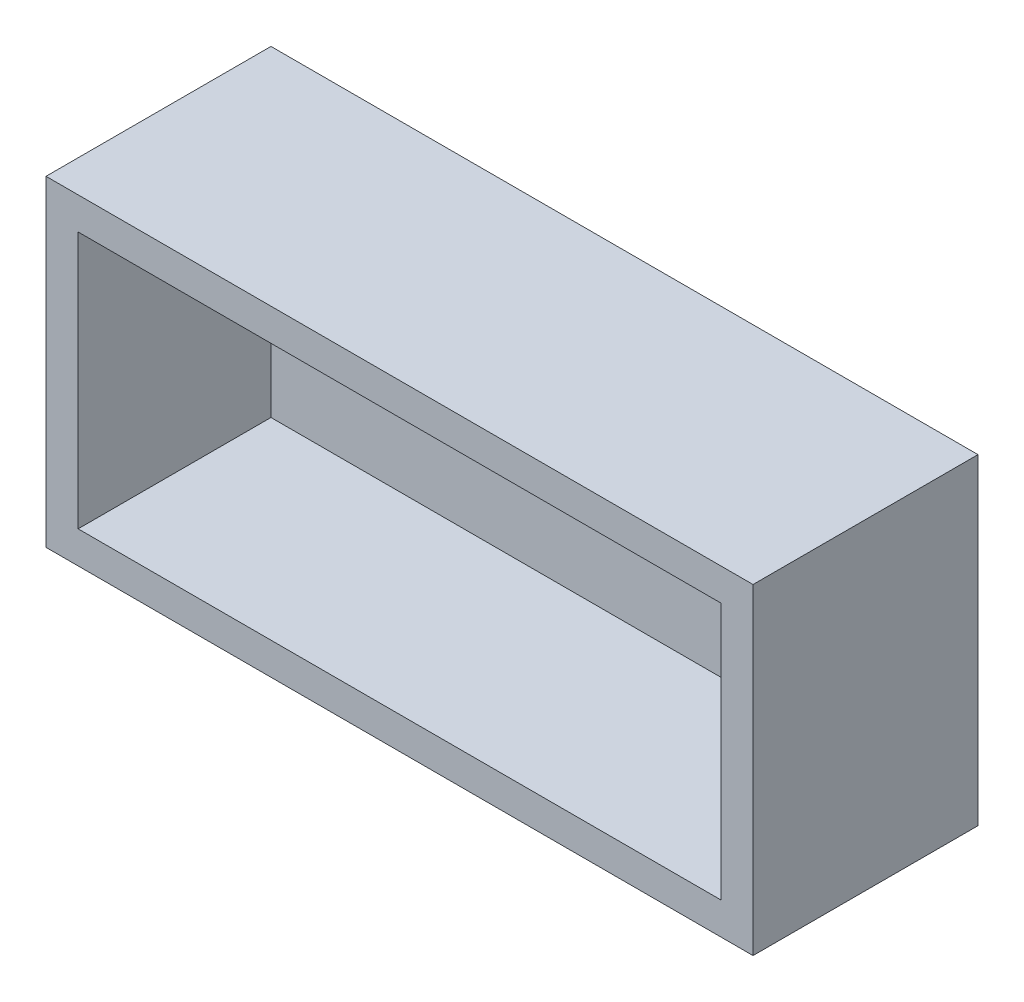
ISO-10303-21;
HEADER;
FILE_DESCRIPTION(('STEP AP214'),'2;1');
FILE_NAME('part.step','',(''),(''),'','','');
FILE_SCHEMA(('AUTOMOTIVE_DESIGN { 1 0 10303 214 1 1 1 1 }'));
ENDSEC;
DATA;
#1=APPLICATION_CONTEXT('core data for automotive mechanical design processes');
#2=APPLICATION_PROTOCOL_DEFINITION('international standard','automotive_design',2000,#1);
#3=PRODUCT_CONTEXT('',#1,'mechanical');
#4=PRODUCT('Part','Part','',(#3));
#5=PRODUCT_RELATED_PRODUCT_CATEGORY('part','',(#4));
#6=PRODUCT_DEFINITION_FORMATION('','',#4);
#7=PRODUCT_DEFINITION_CONTEXT('part definition',#1,'design');
#8=PRODUCT_DEFINITION('design','',#6,#7);
#9=PRODUCT_DEFINITION_SHAPE('','',#8);
#10=(LENGTH_UNIT() NAMED_UNIT(*) SI_UNIT(.MILLI.,.METRE.));
#11=(NAMED_UNIT(*) PLANE_ANGLE_UNIT() SI_UNIT($,.RADIAN.));
#12=(NAMED_UNIT(*) SI_UNIT($,.STERADIAN.) SOLID_ANGLE_UNIT());
#13=UNCERTAINTY_MEASURE_WITH_UNIT(LENGTH_MEASURE(1.E-05),#10,'distance_accuracy_value','');
#14=(GEOMETRIC_REPRESENTATION_CONTEXT(3) GLOBAL_UNCERTAINTY_ASSIGNED_CONTEXT((#13)) GLOBAL_UNIT_ASSIGNED_CONTEXT((#10,
#11,#12)) REPRESENTATION_CONTEXT('',''));
#15=CARTESIAN_POINT('',(0.,0.,0.));
#16=DIRECTION('',(0.,0.,1.));
#17=DIRECTION('',(1.,0.,0.));
#18=AXIS2_PLACEMENT_3D('',#15,#16,#17);
#19=CARTESIAN_POINT('',(0.,0.,9.));
#20=DIRECTION('',(0.,0.,1.));
#21=DIRECTION('',(1.,0.,0.));
#22=AXIS2_PLACEMENT_3D('',#19,#20,#21);
#23=PLANE('',#22);
#24=DIRECTION('',(0.,-1.,0.));
#25=VECTOR('',#24,1.);
#26=CARTESIAN_POINT('',(-53.5900984549038,28.935354346355,9.));
#27=LINE('',#26,#25);
#28=CARTESIAN_POINT('',(-53.5900984549038,28.935354346355,9.));
#29=VERTEX_POINT('',#28);
#30=CARTESIAN_POINT('',(-53.5900984549038,13.935354346355,9.));
#31=VERTEX_POINT('',#30);
#32=EDGE_CURVE('E154',#29,#31,#27,.T.);
#33=ORIENTED_EDGE('',*,*,#32,.T.);
#34=DIRECTION('',(1.,0.,0.));
#35=VECTOR('',#34,1.);
#36=CARTESIAN_POINT('',(-53.5900984549038,13.935354346355,9.));
#37=LINE('',#36,#35);
#38=CARTESIAN_POINT('',(-20.5900984549038,13.935354346355,9.));
#39=VERTEX_POINT('',#38);
#40=EDGE_CURVE('E101',#31,#39,#37,.T.);
#41=ORIENTED_EDGE('',*,*,#40,.T.);
#42=DIRECTION('',(0.,1.,0.));
#43=VECTOR('',#42,1.);
#44=CARTESIAN_POINT('',(-20.5900984549038,13.935354346355,9.));
#45=LINE('',#44,#43);
#46=CARTESIAN_POINT('',(-20.5900984549038,28.935354346355,9.));
#47=VERTEX_POINT('',#46);
#48=EDGE_CURVE('E157',#39,#47,#45,.T.);
#49=ORIENTED_EDGE('',*,*,#48,.T.);
#50=DIRECTION('',(-1.,0.,0.));
#51=VECTOR('',#50,1.);
#52=CARTESIAN_POINT('',(-53.5900984549038,28.935354346355,9.));
#53=LINE('',#52,#51);
#54=EDGE_CURVE('E55',#47,#29,#53,.T.);
#55=ORIENTED_EDGE('',*,*,#54,.T.);
#56=EDGE_LOOP('',(#33,#41,#49,#55));
#57=FACE_BOUND('',#56,.T.);
#58=DIRECTION('',(1.,0.,0.));
#59=VECTOR('',#58,1.);
#60=CARTESIAN_POINT('',(-52.0900984549038,15.435354346355,9.));
#61=LINE('',#60,#59);
#62=CARTESIAN_POINT('',(-52.0900984549038,15.435354346355,9.));
#63=VERTEX_POINT('',#62);
#64=CARTESIAN_POINT('',(-22.0900984549038,15.435354346355,9.));
#65=VERTEX_POINT('',#64);
#66=EDGE_CURVE('E129',#63,#65,#61,.T.);
#67=ORIENTED_EDGE('',*,*,#66,.F.);
#68=DIRECTION('',(0.,-1.,0.));
#69=VECTOR('',#68,1.);
#70=CARTESIAN_POINT('',(-52.0900984549038,27.435354346355,9.));
#71=LINE('',#70,#69);
#72=CARTESIAN_POINT('',(-52.0900984549038,27.435354346355,9.));
#73=VERTEX_POINT('',#72);
#74=EDGE_CURVE('E127',#73,#63,#71,.T.);
#75=ORIENTED_EDGE('',*,*,#74,.F.);
#76=DIRECTION('',(-1.,0.,0.));
#77=VECTOR('',#76,1.);
#78=CARTESIAN_POINT('',(-52.0900984549038,27.435354346355,9.));
#79=LINE('',#78,#77);
#80=CARTESIAN_POINT('',(-22.0900984549038,27.435354346355,9.));
#81=VERTEX_POINT('',#80);
#82=EDGE_CURVE('E134',#81,#73,#79,.T.);
#83=ORIENTED_EDGE('',*,*,#82,.F.);
#84=DIRECTION('',(0.,1.,0.));
#85=VECTOR('',#84,1.);
#86=CARTESIAN_POINT('',(-22.0900984549038,15.435354346355,9.));
#87=LINE('',#86,#85);
#88=EDGE_CURVE('E132',#65,#81,#87,.T.);
#89=ORIENTED_EDGE('',*,*,#88,.F.);
#90=EDGE_LOOP('',(#67,#75,#83,#89));
#91=FACE_BOUND('',#90,.T.);
#92=ADVANCED_FACE('F32',(#57,#91),#23,.T.);
#93=CARTESIAN_POINT('',(-53.5900984549038,28.935354346355,9.));
#94=DIRECTION('',(1.,0.,0.));
#95=DIRECTION('',(0.,0.,-1.));
#96=AXIS2_PLACEMENT_3D('',#93,#94,#95);
#97=PLANE('',#96);
#98=DIRECTION('',(0.,0.,-1.));
#99=VECTOR('',#98,1.);
#100=CARTESIAN_POINT('',(-53.5900984549038,28.935354346355,9.));
#101=LINE('',#100,#99);
#102=CARTESIAN_POINT('',(-53.5900984549038,28.935354346355,-1.5));
#103=VERTEX_POINT('',#102);
#104=EDGE_CURVE('E115',#29,#103,#101,.T.);
#105=ORIENTED_EDGE('',*,*,#104,.T.);
#106=DIRECTION('',(0.,-1.,0.));
#107=VECTOR('',#106,1.);
#108=CARTESIAN_POINT('',(-53.5900984549038,28.935354346355,-1.5));
#109=LINE('',#108,#107);
#110=CARTESIAN_POINT('',(-53.5900984549038,13.935354346355,-1.5));
#111=VERTEX_POINT('',#110);
#112=EDGE_CURVE('E110',#103,#111,#109,.T.);
#113=ORIENTED_EDGE('',*,*,#112,.T.);
#114=DIRECTION('',(0.,0.,-1.));
#115=VECTOR('',#114,1.);
#116=CARTESIAN_POINT('',(-53.5900984549038,13.935354346355,9.));
#117=LINE('',#116,#115);
#118=EDGE_CURVE('E11',#31,#111,#117,.T.);
#119=ORIENTED_EDGE('',*,*,#118,.F.);
#120=ORIENTED_EDGE('',*,*,#32,.F.);
#121=EDGE_LOOP('',(#105,#113,#119,#120));
#122=FACE_BOUND('',#121,.T.);
#123=ADVANCED_FACE('F34',(#122),#97,.F.);
#124=CARTESIAN_POINT('',(-53.5900984549038,13.935354346355,9.));
#125=DIRECTION('',(0.,1.,0.));
#126=DIRECTION('',(0.,0.,1.));
#127=AXIS2_PLACEMENT_3D('',#124,#125,#126);
#128=PLANE('',#127);
#129=ORIENTED_EDGE('',*,*,#118,.T.);
#130=DIRECTION('',(1.,0.,0.));
#131=VECTOR('',#130,1.);
#132=CARTESIAN_POINT('',(-53.5900984549038,13.935354346355,-1.5));
#133=LINE('',#132,#131);
#134=CARTESIAN_POINT('',(-20.5900984549038,13.935354346355,-1.5));
#135=VERTEX_POINT('',#134);
#136=EDGE_CURVE('E100',#111,#135,#133,.T.);
#137=ORIENTED_EDGE('',*,*,#136,.T.);
#138=DIRECTION('',(0.,0.,-1.));
#139=VECTOR('',#138,1.);
#140=CARTESIAN_POINT('',(-20.5900984549038,13.935354346355,9.));
#141=LINE('',#140,#139);
#142=EDGE_CURVE('E40',#39,#135,#141,.T.);
#143=ORIENTED_EDGE('',*,*,#142,.F.);
#144=ORIENTED_EDGE('',*,*,#40,.F.);
#145=EDGE_LOOP('',(#129,#137,#143,#144));
#146=FACE_BOUND('',#145,.T.);
#147=ADVANCED_FACE('F98',(#146),#128,.F.);
#148=CARTESIAN_POINT('',(-20.5900984549038,13.935354346355,9.));
#149=DIRECTION('',(-1.,0.,0.));
#150=DIRECTION('',(0.,0.,1.));
#151=AXIS2_PLACEMENT_3D('',#148,#149,#150);
#152=PLANE('',#151);
#153=ORIENTED_EDGE('',*,*,#142,.T.);
#154=DIRECTION('',(0.,1.,0.));
#155=VECTOR('',#154,1.);
#156=CARTESIAN_POINT('',(-20.5900984549038,13.935354346355,-1.5));
#157=LINE('',#156,#155);
#158=CARTESIAN_POINT('',(-20.5900984549038,28.935354346355,-1.5));
#159=VERTEX_POINT('',#158);
#160=EDGE_CURVE('E113',#135,#159,#157,.T.);
#161=ORIENTED_EDGE('',*,*,#160,.T.);
#162=DIRECTION('',(0.,0.,-1.));
#163=VECTOR('',#162,1.);
#164=CARTESIAN_POINT('',(-20.5900984549038,28.935354346355,9.));
#165=LINE('',#164,#163);
#166=EDGE_CURVE('E161',#47,#159,#165,.T.);
#167=ORIENTED_EDGE('',*,*,#166,.F.);
#168=ORIENTED_EDGE('',*,*,#48,.F.);
#169=EDGE_LOOP('',(#153,#161,#167,#168));
#170=FACE_BOUND('',#169,.T.);
#171=ADVANCED_FACE('F164',(#170),#152,.F.);
#172=CARTESIAN_POINT('',(-53.5900984549038,28.935354346355,9.));
#173=DIRECTION('',(0.,-1.,0.));
#174=DIRECTION('',(0.,0.,-1.));
#175=AXIS2_PLACEMENT_3D('',#172,#173,#174);
#176=PLANE('',#175);
#177=ORIENTED_EDGE('',*,*,#166,.T.);
#178=DIRECTION('',(-1.,0.,0.));
#179=VECTOR('',#178,1.);
#180=CARTESIAN_POINT('',(-53.5900984549038,28.935354346355,-1.5));
#181=LINE('',#180,#179);
#182=EDGE_CURVE('E124',#159,#103,#181,.T.);
#183=ORIENTED_EDGE('',*,*,#182,.T.);
#184=ORIENTED_EDGE('',*,*,#104,.F.);
#185=ORIENTED_EDGE('',*,*,#54,.F.);
#186=EDGE_LOOP('',(#177,#183,#184,#185));
#187=FACE_BOUND('',#186,.T.);
#188=ADVANCED_FACE('F201',(#187),#176,.F.);
#189=CARTESIAN_POINT('',(-52.0900984549038,27.435354346355,9.));
#190=DIRECTION('',(1.,0.,0.));
#191=DIRECTION('',(0.,0.,-1.));
#192=AXIS2_PLACEMENT_3D('',#189,#190,#191);
#193=PLANE('',#192);
#194=DIRECTION('',(0.,-1.,0.));
#195=VECTOR('',#194,1.);
#196=CARTESIAN_POINT('',(-52.0900984549038,27.435354346355,0.));
#197=LINE('',#196,#195);
#198=CARTESIAN_POINT('',(-52.0900984549038,27.435354346355,0.));
#199=VERTEX_POINT('',#198);
#200=CARTESIAN_POINT('',(-52.0900984549038,15.435354346355,0.));
#201=VERTEX_POINT('',#200);
#202=EDGE_CURVE('E126',#199,#201,#197,.T.);
#203=ORIENTED_EDGE('',*,*,#202,.F.);
#204=DIRECTION('',(0.,0.,-1.));
#205=VECTOR('',#204,1.);
#206=CARTESIAN_POINT('',(-52.0900984549038,27.435354346355,9.));
#207=LINE('',#206,#205);
#208=EDGE_CURVE('E136',#73,#199,#207,.T.);
#209=ORIENTED_EDGE('',*,*,#208,.F.);
#210=ORIENTED_EDGE('',*,*,#74,.T.);
#211=DIRECTION('',(0.,0.,-1.));
#212=VECTOR('',#211,1.);
#213=CARTESIAN_POINT('',(-52.0900984549038,15.435354346355,9.));
#214=LINE('',#213,#212);
#215=EDGE_CURVE('E151',#63,#201,#214,.T.);
#216=ORIENTED_EDGE('',*,*,#215,.T.);
#217=EDGE_LOOP('',(#203,#209,#210,#216));
#218=FACE_BOUND('',#217,.T.);
#219=ADVANCED_FACE('F184',(#218),#193,.T.);
#220=CARTESIAN_POINT('',(-52.0900984549038,15.435354346355,9.));
#221=DIRECTION('',(0.,1.,0.));
#222=DIRECTION('',(0.,0.,1.));
#223=AXIS2_PLACEMENT_3D('',#220,#221,#222);
#224=PLANE('',#223);
#225=DIRECTION('',(1.,0.,0.));
#226=VECTOR('',#225,1.);
#227=CARTESIAN_POINT('',(-52.0900984549038,15.435354346355,0.));
#228=LINE('',#227,#226);
#229=CARTESIAN_POINT('',(-22.0900984549038,15.435354346355,0.));
#230=VERTEX_POINT('',#229);
#231=EDGE_CURVE('E139',#201,#230,#228,.T.);
#232=ORIENTED_EDGE('',*,*,#231,.F.);
#233=ORIENTED_EDGE('',*,*,#215,.F.);
#234=ORIENTED_EDGE('',*,*,#66,.T.);
#235=DIRECTION('',(0.,0.,-1.));
#236=VECTOR('',#235,1.);
#237=CARTESIAN_POINT('',(-22.0900984549038,15.435354346355,9.));
#238=LINE('',#237,#236);
#239=EDGE_CURVE('E149',#65,#230,#238,.T.);
#240=ORIENTED_EDGE('',*,*,#239,.T.);
#241=EDGE_LOOP('',(#232,#233,#234,#240));
#242=FACE_BOUND('',#241,.T.);
#243=ADVANCED_FACE('F176',(#242),#224,.T.);
#244=CARTESIAN_POINT('',(-22.0900984549038,15.435354346355,9.));
#245=DIRECTION('',(-1.,0.,0.));
#246=DIRECTION('',(0.,0.,1.));
#247=AXIS2_PLACEMENT_3D('',#244,#245,#246);
#248=PLANE('',#247);
#249=DIRECTION('',(0.,1.,0.));
#250=VECTOR('',#249,1.);
#251=CARTESIAN_POINT('',(-22.0900984549038,15.435354346355,0.));
#252=LINE('',#251,#250);
#253=CARTESIAN_POINT('',(-22.0900984549038,27.435354346355,0.));
#254=VERTEX_POINT('',#253);
#255=EDGE_CURVE('E142',#230,#254,#252,.T.);
#256=ORIENTED_EDGE('',*,*,#255,.F.);
#257=ORIENTED_EDGE('',*,*,#239,.F.);
#258=ORIENTED_EDGE('',*,*,#88,.T.);
#259=DIRECTION('',(0.,0.,-1.));
#260=VECTOR('',#259,1.);
#261=CARTESIAN_POINT('',(-22.0900984549038,27.435354346355,9.));
#262=LINE('',#261,#260);
#263=EDGE_CURVE('E47',#81,#254,#262,.T.);
#264=ORIENTED_EDGE('',*,*,#263,.T.);
#265=EDGE_LOOP('',(#256,#257,#258,#264));
#266=FACE_BOUND('',#265,.T.);
#267=ADVANCED_FACE('F179',(#266),#248,.T.);
#268=CARTESIAN_POINT('',(-52.0900984549038,27.435354346355,9.));
#269=DIRECTION('',(0.,-1.,0.));
#270=DIRECTION('',(0.,0.,-1.));
#271=AXIS2_PLACEMENT_3D('',#268,#269,#270);
#272=PLANE('',#271);
#273=DIRECTION('',(-1.,0.,0.));
#274=VECTOR('',#273,1.);
#275=CARTESIAN_POINT('',(-52.0900984549038,27.435354346355,0.));
#276=LINE('',#275,#274);
#277=EDGE_CURVE('E130',#254,#199,#276,.T.);
#278=ORIENTED_EDGE('',*,*,#277,.F.);
#279=ORIENTED_EDGE('',*,*,#263,.F.);
#280=ORIENTED_EDGE('',*,*,#82,.T.);
#281=ORIENTED_EDGE('',*,*,#208,.T.);
#282=EDGE_LOOP('',(#278,#279,#280,#281));
#283=FACE_BOUND('',#282,.T.);
#284=ADVANCED_FACE('F186',(#283),#272,.T.);
#285=CARTESIAN_POINT('',(0.,0.,0.));
#286=DIRECTION('',(0.,0.,1.));
#287=DIRECTION('',(1.,0.,0.));
#288=AXIS2_PLACEMENT_3D('',#285,#286,#287);
#289=PLANE('',#288);
#290=CARTESIAN_POINT('',(-37.0900984549038,21.435354346355,0.));
#291=DIRECTION('',(0.,0.,1.));
#292=DIRECTION('',(1.,0.,0.));
#293=AXIS2_PLACEMENT_3D('',#290,#291,#292);
#294=CIRCLE('',#293,0.999999999999998);
#295=CARTESIAN_POINT('',(-36.0900984549038,21.435354346355,0.));
#296=VERTEX_POINT('',#295);
#297=EDGE_CURVE('E119',#296,#296,#294,.T.);
#298=ORIENTED_EDGE('',*,*,#297,.F.);
#299=EDGE_LOOP('',(#298));
#300=FACE_BOUND('',#299,.T.);
#301=ORIENTED_EDGE('',*,*,#277,.T.);
#302=ORIENTED_EDGE('',*,*,#202,.T.);
#303=ORIENTED_EDGE('',*,*,#231,.T.);
#304=ORIENTED_EDGE('',*,*,#255,.T.);
#305=EDGE_LOOP('',(#301,#302,#303,#304));
#306=FACE_BOUND('',#305,.T.);
#307=ADVANCED_FACE('F181',(#300,#306),#289,.T.);
#308=CARTESIAN_POINT('',(0.,0.,-1.5));
#309=DIRECTION('',(0.,0.,1.));
#310=DIRECTION('',(1.,0.,0.));
#311=AXIS2_PLACEMENT_3D('',#308,#309,#310);
#312=PLANE('',#311);
#313=CARTESIAN_POINT('',(-37.0900984549038,21.435354346355,-1.5));
#314=DIRECTION('',(0.,0.,1.));
#315=DIRECTION('',(1.,0.,0.));
#316=AXIS2_PLACEMENT_3D('',#313,#314,#315);
#317=CIRCLE('',#316,0.999999999999998);
#318=CARTESIAN_POINT('',(-36.0900984549038,21.435354346355,-1.5));
#319=VERTEX_POINT('',#318);
#320=EDGE_CURVE('E116',#319,#319,#317,.T.);
#321=ORIENTED_EDGE('',*,*,#320,.T.);
#322=EDGE_LOOP('',(#321));
#323=FACE_BOUND('',#322,.T.);
#324=ORIENTED_EDGE('',*,*,#112,.F.);
#325=ORIENTED_EDGE('',*,*,#182,.F.);
#326=ORIENTED_EDGE('',*,*,#160,.F.);
#327=ORIENTED_EDGE('',*,*,#136,.F.);
#328=EDGE_LOOP('',(#324,#325,#326,#327));
#329=FACE_BOUND('',#328,.T.);
#330=ADVANCED_FACE('F108',(#323,#329),#312,.F.);
#331=CARTESIAN_POINT('',(-37.0900984549038,21.435354346355,-1.5));
#332=DIRECTION('',(0.,0.,1.));
#333=DIRECTION('',(1.,0.,0.));
#334=AXIS2_PLACEMENT_3D('',#331,#332,#333);
#335=CYLINDRICAL_SURFACE('',#334,0.999999999999998);
#336=ORIENTED_EDGE('',*,*,#320,.F.);
#337=EDGE_LOOP('',(#336));
#338=FACE_BOUND('',#337,.T.);
#339=ORIENTED_EDGE('',*,*,#297,.T.);
#340=EDGE_LOOP('',(#339));
#341=FACE_BOUND('',#340,.T.);
#342=ADVANCED_FACE('F276',(#338,#341),#335,.F.);
#343=CLOSED_SHELL('',(#92,#123,#147,#171,#188,#219,#243,#267,#284,#307,#330,#342));
#344=MANIFOLD_SOLID_BREP('B2',#343);
#345=ADVANCED_BREP_SHAPE_REPRESENTATION('',(#18,#344),#14);
#346=SHAPE_DEFINITION_REPRESENTATION(#9,#345);
ENDSEC;
END-ISO-10303-21;
